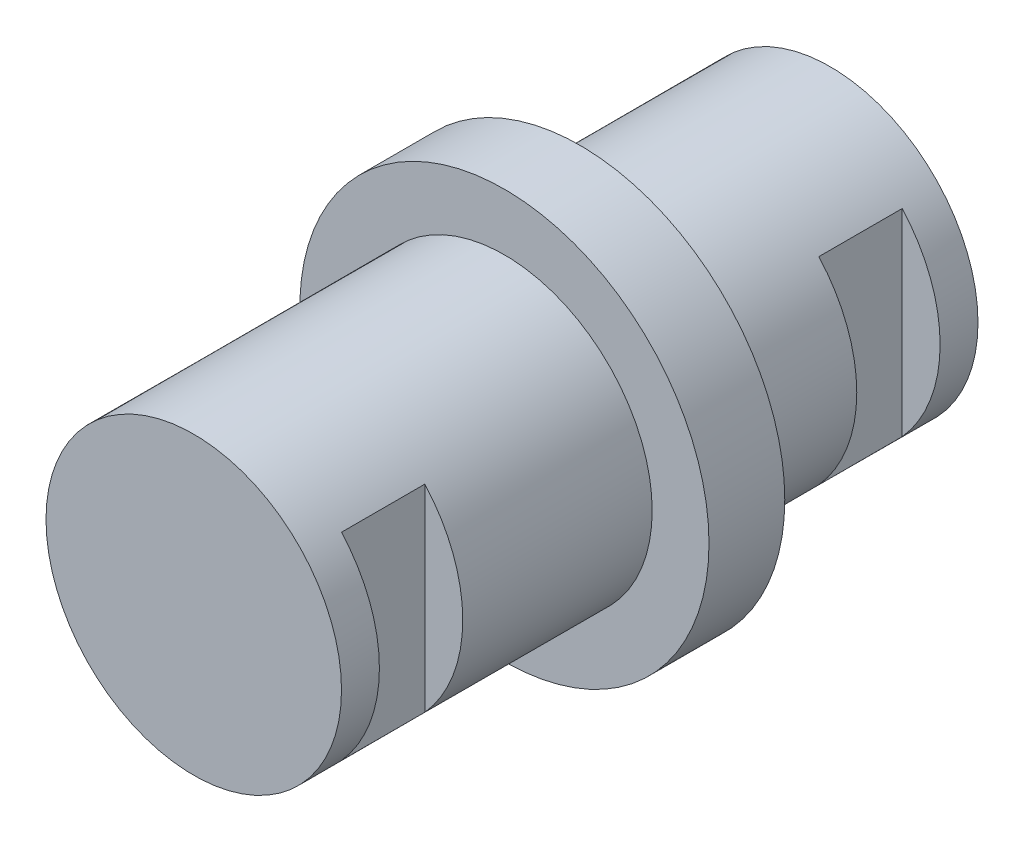
ISO-10303-21;
HEADER;
FILE_DESCRIPTION(('STEP AP214'),'2;1');
FILE_NAME('part.step','',(''),(''),'','','');
FILE_SCHEMA(('AUTOMOTIVE_DESIGN { 1 0 10303 214 1 1 1 1 }'));
ENDSEC;
DATA;
#1=APPLICATION_CONTEXT('core data for automotive mechanical design processes');
#2=APPLICATION_PROTOCOL_DEFINITION('international standard','automotive_design',2000,#1);
#3=PRODUCT_CONTEXT('',#1,'mechanical');
#4=PRODUCT('Part','Part','',(#3));
#5=PRODUCT_RELATED_PRODUCT_CATEGORY('part','',(#4));
#6=PRODUCT_DEFINITION_FORMATION('','',#4);
#7=PRODUCT_DEFINITION_CONTEXT('part definition',#1,'design');
#8=PRODUCT_DEFINITION('design','',#6,#7);
#9=PRODUCT_DEFINITION_SHAPE('','',#8);
#10=(LENGTH_UNIT() NAMED_UNIT(*) SI_UNIT(.MILLI.,.METRE.));
#11=(NAMED_UNIT(*) PLANE_ANGLE_UNIT() SI_UNIT($,.RADIAN.));
#12=(NAMED_UNIT(*) SI_UNIT($,.STERADIAN.) SOLID_ANGLE_UNIT());
#13=UNCERTAINTY_MEASURE_WITH_UNIT(LENGTH_MEASURE(1.E-05),#10,'distance_accuracy_value','');
#14=(GEOMETRIC_REPRESENTATION_CONTEXT(3) GLOBAL_UNCERTAINTY_ASSIGNED_CONTEXT((#13)) GLOBAL_UNIT_ASSIGNED_CONTEXT((#10,
#11,#12)) REPRESENTATION_CONTEXT('',''));
#15=CARTESIAN_POINT('',(0.,0.,0.));
#16=DIRECTION('',(0.,0.,1.));
#17=DIRECTION('',(1.,0.,0.));
#18=AXIS2_PLACEMENT_3D('',#15,#16,#17);
#19=CARTESIAN_POINT('',(0.,0.,21.336));
#20=DIRECTION('',(0.,0.,-1.));
#21=DIRECTION('',(-1.,0.,0.));
#22=AXIS2_PLACEMENT_3D('',#19,#20,#21);
#23=CYLINDRICAL_SURFACE('',#22,4.953);
#24=CARTESIAN_POINT('',(0.,0.,4.064));
#25=DIRECTION('',(0.,0.,1.));
#26=DIRECTION('',(1.,0.,0.));
#27=AXIS2_PLACEMENT_3D('',#24,#25,#26);
#28=CIRCLE('',#27,4.953);
#29=CARTESIAN_POINT('',(3.68300000000001,-3.31175482184294,4.064));
#30=VERTEX_POINT('',#29);
#31=CARTESIAN_POINT('',(3.683,3.31175482184294,4.064));
#32=VERTEX_POINT('',#31);
#33=EDGE_CURVE('E223',#30,#32,#28,.T.);
#34=ORIENTED_EDGE('',*,*,#33,.T.);
#35=DIRECTION('',(0.,0.,-1.));
#36=VECTOR('',#35,1.);
#37=CARTESIAN_POINT('',(3.68300000000001,3.31175482184294,21.336));
#38=LINE('',#37,#36);
#39=CARTESIAN_POINT('',(3.683,3.31175482184294,1.27));
#40=VERTEX_POINT('',#39);
#41=EDGE_CURVE('E122',#32,#40,#38,.T.);
#42=ORIENTED_EDGE('',*,*,#41,.T.);
#43=CARTESIAN_POINT('',(0.,0.,1.27));
#44=DIRECTION('',(0.,0.,1.));
#45=DIRECTION('',(1.,0.,0.));
#46=AXIS2_PLACEMENT_3D('',#43,#44,#45);
#47=CIRCLE('',#46,4.953);
#48=CARTESIAN_POINT('',(3.683,-3.31175482184294,1.27));
#49=VERTEX_POINT('',#48);
#50=EDGE_CURVE('E226',#49,#40,#47,.T.);
#51=ORIENTED_EDGE('',*,*,#50,.F.);
#52=DIRECTION('',(0.,0.,-1.));
#53=VECTOR('',#52,1.);
#54=CARTESIAN_POINT('',(3.68300000000001,-3.31175482184294,21.336));
#55=LINE('',#54,#53);
#56=EDGE_CURVE('E219',#49,#30,#55,.F.);
#57=ORIENTED_EDGE('',*,*,#56,.T.);
#58=EDGE_LOOP('',(#34,#42,#51,#57));
#59=FACE_BOUND('',#58,.T.);
#60=DIRECTION('',(0.,0.,-1.));
#61=VECTOR('',#60,1.);
#62=CARTESIAN_POINT('',(-3.683,3.31175482184295,21.336));
#63=LINE('',#62,#61);
#64=CARTESIAN_POINT('',(-3.683,3.31175482184295,4.064));
#65=VERTEX_POINT('',#64);
#66=CARTESIAN_POINT('',(-3.683,3.31175482184295,1.27));
#67=VERTEX_POINT('',#66);
#68=EDGE_CURVE('E211',#65,#67,#63,.T.);
#69=ORIENTED_EDGE('',*,*,#68,.F.);
#70=CARTESIAN_POINT('',(0.,0.,4.064));
#71=DIRECTION('',(0.,0.,1.));
#72=DIRECTION('',(1.,0.,0.));
#73=AXIS2_PLACEMENT_3D('',#70,#71,#72);
#74=CIRCLE('',#73,4.953);
#75=CARTESIAN_POINT('',(-3.683,-3.31175482184295,4.064));
#76=VERTEX_POINT('',#75);
#77=EDGE_CURVE('E215',#65,#76,#74,.T.);
#78=ORIENTED_EDGE('',*,*,#77,.T.);
#79=DIRECTION('',(0.,0.,-1.));
#80=VECTOR('',#79,1.);
#81=CARTESIAN_POINT('',(-3.683,-3.31175482184295,21.336));
#82=LINE('',#81,#80);
#83=CARTESIAN_POINT('',(-3.683,-3.31175482184295,1.27));
#84=VERTEX_POINT('',#83);
#85=EDGE_CURVE('E208',#84,#76,#82,.F.);
#86=ORIENTED_EDGE('',*,*,#85,.F.);
#87=CARTESIAN_POINT('',(0.,0.,1.27));
#88=DIRECTION('',(0.,0.,1.));
#89=DIRECTION('',(1.,0.,0.));
#90=AXIS2_PLACEMENT_3D('',#87,#88,#89);
#91=CIRCLE('',#90,4.953);
#92=EDGE_CURVE('E205',#67,#84,#91,.T.);
#93=ORIENTED_EDGE('',*,*,#92,.F.);
#94=EDGE_LOOP('',(#69,#78,#86,#93));
#95=FACE_BOUND('',#94,.T.);
#96=CARTESIAN_POINT('',(0.,0.,0.));
#97=DIRECTION('',(0.,0.,1.));
#98=DIRECTION('',(1.,0.,0.));
#99=AXIS2_PLACEMENT_3D('',#96,#97,#98);
#100=CIRCLE('',#99,4.953);
#101=CARTESIAN_POINT('',(4.953,0.,0.));
#102=VERTEX_POINT('',#101);
#103=EDGE_CURVE('E195',#102,#102,#100,.T.);
#104=ORIENTED_EDGE('',*,*,#103,.T.);
#105=EDGE_LOOP('',(#104));
#106=FACE_BOUND('',#105,.T.);
#107=CARTESIAN_POINT('',(0.,0.,8.382));
#108=DIRECTION('',(0.,0.,1.));
#109=DIRECTION('',(1.,0.,0.));
#110=AXIS2_PLACEMENT_3D('',#107,#108,#109);
#111=CIRCLE('',#110,4.953);
#112=CARTESIAN_POINT('',(4.953,0.,8.382));
#113=VERTEX_POINT('',#112);
#114=EDGE_CURVE('E194',#113,#113,#111,.T.);
#115=ORIENTED_EDGE('',*,*,#114,.F.);
#116=EDGE_LOOP('',(#115));
#117=FACE_BOUND('',#116,.T.);
#118=ADVANCED_FACE('F45',(#59,#95,#106,#117),#23,.T.);
#119=CARTESIAN_POINT('',(0.,0.,0.));
#120=DIRECTION('',(0.,0.,1.));
#121=DIRECTION('',(1.,0.,0.));
#122=AXIS2_PLACEMENT_3D('',#119,#120,#121);
#123=PLANE('',#122);
#124=ORIENTED_EDGE('',*,*,#103,.F.);
#125=EDGE_LOOP('',(#124));
#126=FACE_BOUND('',#125,.T.);
#127=ADVANCED_FACE('F253',(#126),#123,.F.);
#128=CARTESIAN_POINT('',(0.,0.,8.382));
#129=DIRECTION('',(0.,0.,1.));
#130=DIRECTION('',(1.,0.,0.));
#131=AXIS2_PLACEMENT_3D('',#128,#129,#130);
#132=CYLINDRICAL_SURFACE('',#131,6.858);
#133=CARTESIAN_POINT('',(0.,0.,8.382));
#134=DIRECTION('',(0.,0.,1.));
#135=DIRECTION('',(1.,0.,0.));
#136=AXIS2_PLACEMENT_3D('',#133,#134,#135);
#137=CIRCLE('',#136,6.858);
#138=CARTESIAN_POINT('',(6.858,0.,8.382));
#139=VERTEX_POINT('',#138);
#140=EDGE_CURVE('E182',#139,#139,#137,.T.);
#141=ORIENTED_EDGE('',*,*,#140,.T.);
#142=EDGE_LOOP('',(#141));
#143=FACE_BOUND('',#142,.T.);
#144=CARTESIAN_POINT('',(0.,0.,10.922));
#145=DIRECTION('',(0.,0.,1.));
#146=DIRECTION('',(1.,0.,0.));
#147=AXIS2_PLACEMENT_3D('',#144,#145,#146);
#148=CIRCLE('',#147,6.858);
#149=CARTESIAN_POINT('',(6.858,0.,10.922));
#150=VERTEX_POINT('',#149);
#151=EDGE_CURVE('E174',#150,#150,#148,.T.);
#152=ORIENTED_EDGE('',*,*,#151,.F.);
#153=EDGE_LOOP('',(#152));
#154=FACE_BOUND('',#153,.T.);
#155=ADVANCED_FACE('F259',(#143,#154),#132,.T.);
#156=CARTESIAN_POINT('',(0.,0.,8.382));
#157=DIRECTION('',(0.,0.,1.));
#158=DIRECTION('',(1.,0.,0.));
#159=AXIS2_PLACEMENT_3D('',#156,#157,#158);
#160=PLANE('',#159);
#161=ORIENTED_EDGE('',*,*,#114,.T.);
#162=EDGE_LOOP('',(#161));
#163=FACE_BOUND('',#162,.T.);
#164=ORIENTED_EDGE('',*,*,#140,.F.);
#165=EDGE_LOOP('',(#164));
#166=FACE_BOUND('',#165,.T.);
#167=ADVANCED_FACE('F276',(#163,#166),#160,.F.);
#168=CARTESIAN_POINT('',(0.,0.,10.922));
#169=DIRECTION('',(0.,0.,1.));
#170=DIRECTION('',(1.,0.,0.));
#171=AXIS2_PLACEMENT_3D('',#168,#169,#170);
#172=PLANE('',#171);
#173=CARTESIAN_POINT('',(0.,0.,10.922));
#174=DIRECTION('',(0.,0.,1.));
#175=DIRECTION('',(1.,0.,0.));
#176=AXIS2_PLACEMENT_3D('',#173,#174,#175);
#177=CIRCLE('',#176,4.953);
#178=CARTESIAN_POINT('',(4.953,0.,10.922));
#179=VERTEX_POINT('',#178);
#180=EDGE_CURVE('E186',#179,#179,#177,.T.);
#181=ORIENTED_EDGE('',*,*,#180,.F.);
#182=EDGE_LOOP('',(#181));
#183=FACE_BOUND('',#182,.T.);
#184=ORIENTED_EDGE('',*,*,#151,.T.);
#185=EDGE_LOOP('',(#184));
#186=FACE_BOUND('',#185,.T.);
#187=ADVANCED_FACE('F271',(#183,#186),#172,.T.);
#188=CARTESIAN_POINT('',(0.,0.,21.336));
#189=DIRECTION('',(0.,0.,1.));
#190=DIRECTION('',(1.,0.,0.));
#191=AXIS2_PLACEMENT_3D('',#188,#189,#190);
#192=PLANE('',#191);
#193=CARTESIAN_POINT('',(0.,0.,21.336));
#194=DIRECTION('',(0.,0.,1.));
#195=DIRECTION('',(1.,0.,0.));
#196=AXIS2_PLACEMENT_3D('',#193,#194,#195);
#197=CIRCLE('',#196,4.953);
#198=CARTESIAN_POINT('',(4.953,0.,21.336));
#199=VERTEX_POINT('',#198);
#200=EDGE_CURVE('E190',#199,#199,#197,.T.);
#201=ORIENTED_EDGE('',*,*,#200,.T.);
#202=EDGE_LOOP('',(#201));
#203=FACE_BOUND('',#202,.T.);
#204=ADVANCED_FACE('F263',(#203),#192,.T.);
#205=CARTESIAN_POINT('',(0.,0.,20.066));
#206=DIRECTION('',(0.,0.,1.));
#207=DIRECTION('',(1.,0.,0.));
#208=AXIS2_PLACEMENT_3D('',#205,#206,#207);
#209=CIRCLE('',#208,4.953);
#210=CARTESIAN_POINT('',(3.683,-3.31175482184294,20.066));
#211=VERTEX_POINT('',#210);
#212=CARTESIAN_POINT('',(3.683,3.31175482184294,20.066));
#213=VERTEX_POINT('',#212);
#214=EDGE_CURVE('E147',#211,#213,#209,.T.);
#215=ORIENTED_EDGE('',*,*,#214,.T.);
#216=DIRECTION('',(0.,0.,-1.));
#217=VECTOR('',#216,1.);
#218=CARTESIAN_POINT('',(3.683,3.31175482184294,21.336));
#219=LINE('',#218,#217);
#220=CARTESIAN_POINT('',(3.683,3.31175482184294,17.272));
#221=VERTEX_POINT('',#220);
#222=EDGE_CURVE('E11',#213,#221,#219,.T.);
#223=ORIENTED_EDGE('',*,*,#222,.T.);
#224=CARTESIAN_POINT('',(0.,0.,17.272));
#225=DIRECTION('',(0.,0.,1.));
#226=DIRECTION('',(1.,0.,0.));
#227=AXIS2_PLACEMENT_3D('',#224,#225,#226);
#228=CIRCLE('',#227,4.953);
#229=CARTESIAN_POINT('',(3.683,-3.31175482184294,17.272));
#230=VERTEX_POINT('',#229);
#231=EDGE_CURVE('E54',#230,#221,#228,.T.);
#232=ORIENTED_EDGE('',*,*,#231,.F.);
#233=DIRECTION('',(0.,0.,-1.));
#234=VECTOR('',#233,1.);
#235=CARTESIAN_POINT('',(3.683,-3.31175482184294,21.336));
#236=LINE('',#235,#234);
#237=EDGE_CURVE('E143',#230,#211,#236,.F.);
#238=ORIENTED_EDGE('',*,*,#237,.T.);
#239=EDGE_LOOP('',(#215,#223,#232,#238));
#240=FACE_BOUND('',#239,.T.);
#241=DIRECTION('',(0.,0.,-1.));
#242=VECTOR('',#241,1.);
#243=CARTESIAN_POINT('',(-3.683,3.31175482184295,21.336));
#244=LINE('',#243,#242);
#245=CARTESIAN_POINT('',(-3.683,3.31175482184295,20.066));
#246=VERTEX_POINT('',#245);
#247=CARTESIAN_POINT('',(-3.683,3.31175482184295,17.272));
#248=VERTEX_POINT('',#247);
#249=EDGE_CURVE('E128',#246,#248,#244,.T.);
#250=ORIENTED_EDGE('',*,*,#249,.F.);
#251=CARTESIAN_POINT('',(0.,0.,20.066));
#252=DIRECTION('',(0.,0.,1.));
#253=DIRECTION('',(1.,0.,0.));
#254=AXIS2_PLACEMENT_3D('',#251,#252,#253);
#255=CIRCLE('',#254,4.953);
#256=CARTESIAN_POINT('',(-3.683,-3.31175482184295,20.066));
#257=VERTEX_POINT('',#256);
#258=EDGE_CURVE('E134',#246,#257,#255,.T.);
#259=ORIENTED_EDGE('',*,*,#258,.T.);
#260=DIRECTION('',(0.,0.,-1.));
#261=VECTOR('',#260,1.);
#262=CARTESIAN_POINT('',(-3.683,-3.31175482184295,21.336));
#263=LINE('',#262,#261);
#264=CARTESIAN_POINT('',(-3.683,-3.31175482184295,17.272));
#265=VERTEX_POINT('',#264);
#266=EDGE_CURVE('E121',#265,#257,#263,.F.);
#267=ORIENTED_EDGE('',*,*,#266,.F.);
#268=CARTESIAN_POINT('',(0.,0.,17.272));
#269=DIRECTION('',(0.,0.,1.));
#270=DIRECTION('',(1.,0.,0.));
#271=AXIS2_PLACEMENT_3D('',#268,#269,#270);
#272=CIRCLE('',#271,4.953);
#273=EDGE_CURVE('E112',#248,#265,#272,.T.);
#274=ORIENTED_EDGE('',*,*,#273,.F.);
#275=EDGE_LOOP('',(#250,#259,#267,#274));
#276=FACE_BOUND('',#275,.T.);
#277=ORIENTED_EDGE('',*,*,#180,.T.);
#278=EDGE_LOOP('',(#277));
#279=FACE_BOUND('',#278,.T.);
#280=ORIENTED_EDGE('',*,*,#200,.F.);
#281=EDGE_LOOP('',(#280));
#282=FACE_BOUND('',#281,.T.);
#283=ADVANCED_FACE('F47',(#240,#276,#279,#282),#23,.T.);
#284=CARTESIAN_POINT('',(-3.683,-6.858,0.));
#285=DIRECTION('',(-1.,0.,0.));
#286=DIRECTION('',(0.,0.,1.));
#287=AXIS2_PLACEMENT_3D('',#284,#285,#286);
#288=PLANE('',#287);
#289=ORIENTED_EDGE('',*,*,#68,.T.);
#290=DIRECTION('',(0.,1.,0.));
#291=VECTOR('',#290,1.);
#292=CARTESIAN_POINT('',(-3.683,-6.858,1.27));
#293=LINE('',#292,#291);
#294=EDGE_CURVE('E163',#84,#67,#293,.T.);
#295=ORIENTED_EDGE('',*,*,#294,.F.);
#296=ORIENTED_EDGE('',*,*,#85,.T.);
#297=DIRECTION('',(0.,1.,0.));
#298=VECTOR('',#297,1.);
#299=CARTESIAN_POINT('',(-3.683,-6.858,4.064));
#300=LINE('',#299,#298);
#301=EDGE_CURVE('E167',#76,#65,#300,.T.);
#302=ORIENTED_EDGE('',*,*,#301,.T.);
#303=EDGE_LOOP('',(#289,#295,#296,#302));
#304=FACE_BOUND('',#303,.T.);
#305=ADVANCED_FACE('F262',(#304),#288,.T.);
#306=CARTESIAN_POINT('',(0.,-6.858,4.064));
#307=DIRECTION('',(0.,0.,1.));
#308=DIRECTION('',(1.,0.,0.));
#309=AXIS2_PLACEMENT_3D('',#306,#307,#308);
#310=PLANE('',#309);
#311=ORIENTED_EDGE('',*,*,#301,.F.);
#312=ORIENTED_EDGE('',*,*,#77,.F.);
#313=EDGE_LOOP('',(#311,#312));
#314=FACE_BOUND('',#313,.T.);
#315=ADVANCED_FACE('F247',(#314),#310,.F.);
#316=CARTESIAN_POINT('',(0.,-6.858,1.27));
#317=DIRECTION('',(0.,0.,1.));
#318=DIRECTION('',(1.,0.,0.));
#319=AXIS2_PLACEMENT_3D('',#316,#317,#318);
#320=PLANE('',#319);
#321=ORIENTED_EDGE('',*,*,#294,.T.);
#322=ORIENTED_EDGE('',*,*,#92,.T.);
#323=EDGE_LOOP('',(#321,#322));
#324=FACE_BOUND('',#323,.T.);
#325=ADVANCED_FACE('F240',(#324),#320,.T.);
#326=CARTESIAN_POINT('',(0.,-6.858,1.27));
#327=DIRECTION('',(0.,0.,1.));
#328=DIRECTION('',(1.,0.,0.));
#329=AXIS2_PLACEMENT_3D('',#326,#327,#328);
#330=PLANE('',#329);
#331=ORIENTED_EDGE('',*,*,#50,.T.);
#332=DIRECTION('',(0.,1.,0.));
#333=VECTOR('',#332,1.);
#334=CARTESIAN_POINT('',(3.683,-6.858,1.27));
#335=LINE('',#334,#333);
#336=EDGE_CURVE('E175',#49,#40,#335,.T.);
#337=ORIENTED_EDGE('',*,*,#336,.F.);
#338=EDGE_LOOP('',(#331,#337));
#339=FACE_BOUND('',#338,.T.);
#340=ADVANCED_FACE('F238',(#339),#330,.T.);
#341=CARTESIAN_POINT('',(0.,-6.858,4.064));
#342=DIRECTION('',(0.,0.,1.));
#343=DIRECTION('',(1.,0.,0.));
#344=AXIS2_PLACEMENT_3D('',#341,#342,#343);
#345=PLANE('',#344);
#346=ORIENTED_EDGE('',*,*,#33,.F.);
#347=DIRECTION('',(0.,1.,0.));
#348=VECTOR('',#347,1.);
#349=CARTESIAN_POINT('',(3.683,-6.858,4.064));
#350=LINE('',#349,#348);
#351=EDGE_CURVE('E69',#30,#32,#350,.T.);
#352=ORIENTED_EDGE('',*,*,#351,.T.);
#353=EDGE_LOOP('',(#346,#352));
#354=FACE_BOUND('',#353,.T.);
#355=ADVANCED_FACE('F236',(#354),#345,.F.);
#356=CARTESIAN_POINT('',(3.683,-6.858,0.));
#357=DIRECTION('',(-1.,0.,0.));
#358=DIRECTION('',(0.,0.,1.));
#359=AXIS2_PLACEMENT_3D('',#356,#357,#358);
#360=PLANE('',#359);
#361=ORIENTED_EDGE('',*,*,#351,.F.);
#362=ORIENTED_EDGE('',*,*,#56,.F.);
#363=ORIENTED_EDGE('',*,*,#336,.T.);
#364=ORIENTED_EDGE('',*,*,#41,.F.);
#365=EDGE_LOOP('',(#361,#362,#363,#364));
#366=FACE_BOUND('',#365,.T.);
#367=ADVANCED_FACE('F233',(#366),#360,.F.);
#368=CARTESIAN_POINT('',(-3.683,-6.858,0.));
#369=DIRECTION('',(-1.,0.,0.));
#370=DIRECTION('',(0.,0.,1.));
#371=AXIS2_PLACEMENT_3D('',#368,#369,#370);
#372=PLANE('',#371);
#373=ORIENTED_EDGE('',*,*,#249,.T.);
#374=DIRECTION('',(0.,1.,0.));
#375=VECTOR('',#374,1.);
#376=CARTESIAN_POINT('',(-3.683,-6.858,17.272));
#377=LINE('',#376,#375);
#378=EDGE_CURVE('E115',#265,#248,#377,.T.);
#379=ORIENTED_EDGE('',*,*,#378,.F.);
#380=ORIENTED_EDGE('',*,*,#266,.T.);
#381=DIRECTION('',(0.,1.,0.));
#382=VECTOR('',#381,1.);
#383=CARTESIAN_POINT('',(-3.683,-6.858,20.066));
#384=LINE('',#383,#382);
#385=EDGE_CURVE('E130',#257,#246,#384,.T.);
#386=ORIENTED_EDGE('',*,*,#385,.T.);
#387=EDGE_LOOP('',(#373,#379,#380,#386));
#388=FACE_BOUND('',#387,.T.);
#389=ADVANCED_FACE('F125',(#388),#372,.T.);
#390=CARTESIAN_POINT('',(0.,-6.858,20.066));
#391=DIRECTION('',(0.,0.,1.));
#392=DIRECTION('',(1.,0.,0.));
#393=AXIS2_PLACEMENT_3D('',#390,#391,#392);
#394=PLANE('',#393);
#395=ORIENTED_EDGE('',*,*,#385,.F.);
#396=ORIENTED_EDGE('',*,*,#258,.F.);
#397=EDGE_LOOP('',(#395,#396));
#398=FACE_BOUND('',#397,.T.);
#399=ADVANCED_FACE('F334',(#398),#394,.F.);
#400=CARTESIAN_POINT('',(0.,-6.858,17.272));
#401=DIRECTION('',(0.,0.,1.));
#402=DIRECTION('',(1.,0.,0.));
#403=AXIS2_PLACEMENT_3D('',#400,#401,#402);
#404=PLANE('',#403);
#405=ORIENTED_EDGE('',*,*,#378,.T.);
#406=ORIENTED_EDGE('',*,*,#273,.T.);
#407=EDGE_LOOP('',(#405,#406));
#408=FACE_BOUND('',#407,.T.);
#409=ADVANCED_FACE('F114',(#408),#404,.T.);
#410=CARTESIAN_POINT('',(0.,-6.858,17.272));
#411=DIRECTION('',(0.,0.,1.));
#412=DIRECTION('',(1.,0.,0.));
#413=AXIS2_PLACEMENT_3D('',#410,#411,#412);
#414=PLANE('',#413);
#415=ORIENTED_EDGE('',*,*,#231,.T.);
#416=DIRECTION('',(0.,1.,0.));
#417=VECTOR('',#416,1.);
#418=CARTESIAN_POINT('',(3.683,-6.858,17.272));
#419=LINE('',#418,#417);
#420=EDGE_CURVE('E155',#230,#221,#419,.T.);
#421=ORIENTED_EDGE('',*,*,#420,.F.);
#422=EDGE_LOOP('',(#415,#421));
#423=FACE_BOUND('',#422,.T.);
#424=ADVANCED_FACE('F154',(#423),#414,.T.);
#425=CARTESIAN_POINT('',(0.,-6.858,20.066));
#426=DIRECTION('',(0.,0.,1.));
#427=DIRECTION('',(1.,0.,0.));
#428=AXIS2_PLACEMENT_3D('',#425,#426,#427);
#429=PLANE('',#428);
#430=ORIENTED_EDGE('',*,*,#214,.F.);
#431=DIRECTION('',(0.,1.,0.));
#432=VECTOR('',#431,1.);
#433=CARTESIAN_POINT('',(3.683,-6.858,20.066));
#434=LINE('',#433,#432);
#435=EDGE_CURVE('E61',#211,#213,#434,.T.);
#436=ORIENTED_EDGE('',*,*,#435,.T.);
#437=EDGE_LOOP('',(#430,#436));
#438=FACE_BOUND('',#437,.T.);
#439=ADVANCED_FACE('F161',(#438),#429,.F.);
#440=CARTESIAN_POINT('',(3.68299999999999,-6.858,0.));
#441=DIRECTION('',(-1.,0.,0.));
#442=DIRECTION('',(0.,0.,1.));
#443=AXIS2_PLACEMENT_3D('',#440,#441,#442);
#444=PLANE('',#443);
#445=ORIENTED_EDGE('',*,*,#435,.F.);
#446=ORIENTED_EDGE('',*,*,#237,.F.);
#447=ORIENTED_EDGE('',*,*,#420,.T.);
#448=ORIENTED_EDGE('',*,*,#222,.F.);
#449=EDGE_LOOP('',(#445,#446,#447,#448));
#450=FACE_BOUND('',#449,.T.);
#451=ADVANCED_FACE('F157',(#450),#444,.F.);
#452=CLOSED_SHELL('',(#118,#127,#155,#167,#187,#204,#283,#305,#315,#325,#340,#355,#367,#389,
#399,#409,#424,#439,#451));
#453=MANIFOLD_SOLID_BREP('B2',#452);
#454=ADVANCED_BREP_SHAPE_REPRESENTATION('',(#18,#453),#14);
#455=SHAPE_DEFINITION_REPRESENTATION(#9,#454);
ENDSEC;
END-ISO-10303-21;
